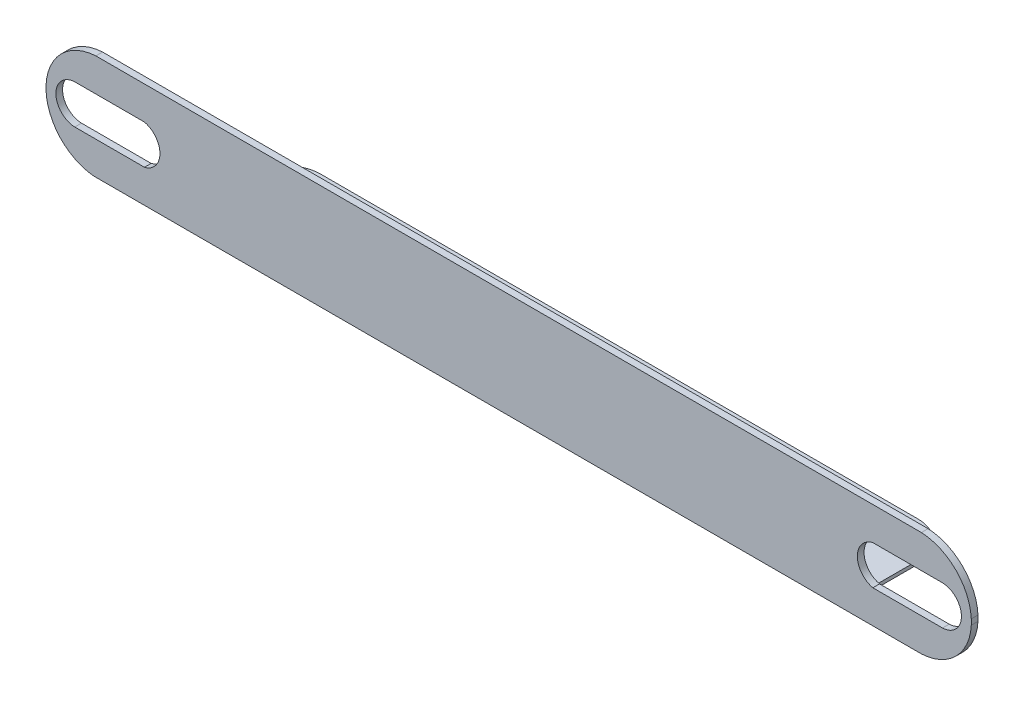
ISO-10303-21;
HEADER;
FILE_DESCRIPTION(('STEP AP214'),'2;1');
FILE_NAME('part.step','',(''),(''),'','','');
FILE_SCHEMA(('AUTOMOTIVE_DESIGN { 1 0 10303 214 1 1 1 1 }'));
ENDSEC;
DATA;
#1=APPLICATION_CONTEXT('core data for automotive mechanical design processes');
#2=APPLICATION_PROTOCOL_DEFINITION('international standard','automotive_design',2000,#1);
#3=PRODUCT_CONTEXT('',#1,'mechanical');
#4=PRODUCT('Part','Part','',(#3));
#5=PRODUCT_RELATED_PRODUCT_CATEGORY('part','',(#4));
#6=PRODUCT_DEFINITION_FORMATION('','',#4);
#7=PRODUCT_DEFINITION_CONTEXT('part definition',#1,'design');
#8=PRODUCT_DEFINITION('design','',#6,#7);
#9=PRODUCT_DEFINITION_SHAPE('','',#8);
#10=(LENGTH_UNIT() NAMED_UNIT(*) SI_UNIT(.MILLI.,.METRE.));
#11=(NAMED_UNIT(*) PLANE_ANGLE_UNIT() SI_UNIT($,.RADIAN.));
#12=(NAMED_UNIT(*) SI_UNIT($,.STERADIAN.) SOLID_ANGLE_UNIT());
#13=UNCERTAINTY_MEASURE_WITH_UNIT(LENGTH_MEASURE(1.E-05),#10,'distance_accuracy_value','');
#14=(GEOMETRIC_REPRESENTATION_CONTEXT(3) GLOBAL_UNCERTAINTY_ASSIGNED_CONTEXT((#13)) GLOBAL_UNIT_ASSIGNED_CONTEXT((#10,
#11,#12)) REPRESENTATION_CONTEXT('',''));
#15=CARTESIAN_POINT('',(0.,0.,0.));
#16=DIRECTION('',(0.,0.,1.));
#17=DIRECTION('',(1.,0.,0.));
#18=AXIS2_PLACEMENT_3D('',#15,#16,#17);
#19=CARTESIAN_POINT('',(0.,0.,0.));
#20=DIRECTION('',(0.,0.,1.));
#21=DIRECTION('',(1.,0.,0.));
#22=AXIS2_PLACEMENT_3D('',#19,#20,#21);
#23=PLANE('',#22);
#24=DIRECTION('',(0.,-1.,0.));
#25=VECTOR('',#24,1.);
#26=CARTESIAN_POINT('',(126.490507007269,-18.669,0.));
#27=LINE('',#26,#25);
#28=CARTESIAN_POINT('',(126.490507007269,-18.669,0.));
#29=VERTEX_POINT('',#28);
#30=CARTESIAN_POINT('',(126.490507007269,-19.939,0.));
#31=VERTEX_POINT('',#30);
#32=EDGE_CURVE('E283',#29,#31,#27,.T.);
#33=ORIENTED_EDGE('',*,*,#32,.F.);
#34=DIRECTION('',(-1.,0.,0.));
#35=VECTOR('',#34,1.);
#36=CARTESIAN_POINT('',(126.490507007269,-18.669,0.));
#37=LINE('',#36,#35);
#38=CARTESIAN_POINT('',(-127.388509507288,-18.669,0.));
#39=VERTEX_POINT('',#38);
#40=EDGE_CURVE('E250',#29,#39,#37,.T.);
#41=ORIENTED_EDGE('',*,*,#40,.T.);
#42=DIRECTION('',(0.,-1.,0.));
#43=VECTOR('',#42,1.);
#44=CARTESIAN_POINT('',(-127.388509507288,-18.669,0.));
#45=LINE('',#44,#43);
#46=CARTESIAN_POINT('',(-127.388509507288,-19.939,0.));
#47=VERTEX_POINT('',#46);
#48=EDGE_CURVE('E269',#39,#47,#45,.T.);
#49=ORIENTED_EDGE('',*,*,#48,.T.);
#50=DIRECTION('',(1.,0.,0.));
#51=VECTOR('',#50,1.);
#52=CARTESIAN_POINT('',(-175.514,-19.939,0.));
#53=LINE('',#52,#51);
#54=CARTESIAN_POINT('',(-157.487509507288,-19.939,0.));
#55=VERTEX_POINT('',#54);
#56=EDGE_CURVE('E347',#55,#47,#53,.T.);
#57=ORIENTED_EDGE('',*,*,#56,.F.);
#58=CARTESIAN_POINT('',(-155.520491397108,-0.0336170515393196,0.));
#59=DIRECTION('',(0.,0.,1.));
#60=DIRECTION('',(1.,0.,0.));
#61=AXIS2_PLACEMENT_3D('',#58,#59,#60);
#62=CIRCLE('',#61,20.0023356278872);
#63=CARTESIAN_POINT('',(-175.514,-0.62779237643969,0.));
#64=VERTEX_POINT('',#63);
#65=EDGE_CURVE('E308',#55,#64,#62,.F.);
#66=ORIENTED_EDGE('',*,*,#65,.T.);
#67=DIRECTION('',(0.,-1.,0.));
#68=VECTOR('',#67,1.);
#69=CARTESIAN_POINT('',(-175.514,19.939,0.));
#70=LINE('',#69,#68);
#71=CARTESIAN_POINT('',(-175.514,0.560558273361051,0.));
#72=VERTEX_POINT('',#71);
#73=EDGE_CURVE('E334',#72,#64,#70,.T.);
#74=ORIENTED_EDGE('',*,*,#73,.F.);
#75=CARTESIAN_POINT('',(-155.520491397108,-0.0336170515393196,0.));
#76=DIRECTION('',(0.,0.,1.));
#77=DIRECTION('',(1.,0.,0.));
#78=AXIS2_PLACEMENT_3D('',#75,#76,#77);
#79=CIRCLE('',#78,20.0023356278872);
#80=CARTESIAN_POINT('',(-156.610444920523,19.939,0.));
#81=VERTEX_POINT('',#80);
#82=EDGE_CURVE('E326',#72,#81,#79,.F.);
#83=ORIENTED_EDGE('',*,*,#82,.T.);
#84=DIRECTION('',(1.,0.,0.));
#85=VECTOR('',#84,1.);
#86=CARTESIAN_POINT('',(-175.514,19.939,0.));
#87=LINE('',#86,#85);
#88=CARTESIAN_POINT('',(156.589507007269,19.939,0.));
#89=VERTEX_POINT('',#88);
#90=EDGE_CURVE('E36',#81,#89,#87,.T.);
#91=ORIENTED_EDGE('',*,*,#90,.T.);
#92=CARTESIAN_POINT('',(155.576786348696,0.,0.));
#93=DIRECTION('',(0.,0.,1.));
#94=DIRECTION('',(1.,0.,0.));
#95=AXIS2_PLACEMENT_3D('',#92,#93,#94);
#96=CIRCLE('',#95,19.9647019545071);
#97=CARTESIAN_POINT('',(175.514,1.04729936244267,0.));
#98=VERTEX_POINT('',#97);
#99=EDGE_CURVE('E321',#98,#89,#96,.T.);
#100=ORIENTED_EDGE('',*,*,#99,.F.);
#101=DIRECTION('',(0.,-1.,0.));
#102=VECTOR('',#101,1.);
#103=CARTESIAN_POINT('',(175.514,19.939,0.));
#104=LINE('',#103,#102);
#105=CARTESIAN_POINT('',(175.514,-1.04729936244268,0.));
#106=VERTEX_POINT('',#105);
#107=EDGE_CURVE('E349',#98,#106,#104,.T.);
#108=ORIENTED_EDGE('',*,*,#107,.T.);
#109=CARTESIAN_POINT('',(155.576786348696,0.,0.));
#110=DIRECTION('',(0.,0.,1.));
#111=DIRECTION('',(1.,0.,0.));
#112=AXIS2_PLACEMENT_3D('',#109,#110,#111);
#113=CIRCLE('',#112,19.9647019545071);
#114=CARTESIAN_POINT('',(156.589507007269,-19.939,0.));
#115=VERTEX_POINT('',#114);
#116=EDGE_CURVE('E299',#115,#106,#113,.T.);
#117=ORIENTED_EDGE('',*,*,#116,.F.);
#118=EDGE_CURVE('E346',#31,#115,#53,.T.);
#119=ORIENTED_EDGE('',*,*,#118,.F.);
#120=EDGE_LOOP('',(#33,#41,#49,#57,#66,#74,#83,#91,#100,#108,#117,#119));
#121=FACE_BOUND('',#120,.T.);
#122=DIRECTION('',(-1.,0.,0.));
#123=VECTOR('',#122,1.);
#124=CARTESIAN_POINT('',(164.606102616265,-7.42142155966785,0.));
#125=LINE('',#124,#123);
#126=CARTESIAN_POINT('',(164.606102616265,-7.42142155966785,0.));
#127=VERTEX_POINT('',#126);
#128=CARTESIAN_POINT('',(138.164214662757,-7.42142155966785,0.));
#129=VERTEX_POINT('',#128);
#130=EDGE_CURVE('E233',#127,#129,#125,.T.);
#131=ORIENTED_EDGE('',*,*,#130,.F.);
#132=CARTESIAN_POINT('',(164.350651350304,-0.00285669356231286,0.));
#133=DIRECTION('',(0.,0.,-1.));
#134=DIRECTION('',(1.,0.,0.));
#135=AXIS2_PLACEMENT_3D('',#132,#133,#134);
#136=CIRCLE('',#135,7.42296167455393);
#137=CARTESIAN_POINT('',(164.606102616265,7.41570817254322,0.));
#138=VERTEX_POINT('',#137);
#139=EDGE_CURVE('E214',#138,#127,#136,.T.);
#140=ORIENTED_EDGE('',*,*,#139,.F.);
#141=DIRECTION('',(1.,0.,0.));
#142=VECTOR('',#141,1.);
#143=CARTESIAN_POINT('',(164.606102616265,7.41570817254322,0.));
#144=LINE('',#143,#142);
#145=CARTESIAN_POINT('',(138.164214662757,7.41570817254322,0.));
#146=VERTEX_POINT('',#145);
#147=EDGE_CURVE('E222',#146,#138,#144,.T.);
#148=ORIENTED_EDGE('',*,*,#147,.F.);
#149=CARTESIAN_POINT('',(139.90470175762,-0.00285669356231297,0.));
#150=DIRECTION('',(0.,0.,-1.));
#151=DIRECTION('',(1.,0.,0.));
#152=AXIS2_PLACEMENT_3D('',#149,#150,#151);
#153=CIRCLE('',#152,7.62);
#154=EDGE_CURVE('E236',#129,#146,#153,.T.);
#155=ORIENTED_EDGE('',*,*,#154,.F.);
#156=EDGE_LOOP('',(#131,#140,#148,#155));
#157=FACE_BOUND('',#156,.T.);
#158=CARTESIAN_POINT('',(-164.350651350304,-0.00285669356231286,0.));
#159=DIRECTION('',(0.,0.,1.));
#160=DIRECTION('',(-1.,0.,0.));
#161=AXIS2_PLACEMENT_3D('',#158,#159,#160);
#162=CIRCLE('',#161,7.42296167455393);
#163=CARTESIAN_POINT('',(-164.606102616265,7.41570817254322,0.));
#164=VERTEX_POINT('',#163);
#165=CARTESIAN_POINT('',(-164.606102616265,-7.42142155966785,0.));
#166=VERTEX_POINT('',#165);
#167=EDGE_CURVE('E49',#164,#166,#162,.T.);
#168=ORIENTED_EDGE('',*,*,#167,.T.);
#169=DIRECTION('',(1.,0.,0.));
#170=VECTOR('',#169,1.);
#171=CARTESIAN_POINT('',(-164.606102616265,-7.42142155966785,0.));
#172=LINE('',#171,#170);
#173=CARTESIAN_POINT('',(-138.164214662757,-7.42142155966785,0.));
#174=VERTEX_POINT('',#173);
#175=EDGE_CURVE('E199',#166,#174,#172,.T.);
#176=ORIENTED_EDGE('',*,*,#175,.T.);
#177=CARTESIAN_POINT('',(-139.90470175762,-0.00285669356231297,0.));
#178=DIRECTION('',(0.,0.,1.));
#179=DIRECTION('',(-1.,0.,0.));
#180=AXIS2_PLACEMENT_3D('',#177,#178,#179);
#181=CIRCLE('',#180,7.62);
#182=CARTESIAN_POINT('',(-138.164214662757,7.41570817254322,0.));
#183=VERTEX_POINT('',#182);
#184=EDGE_CURVE('E202',#174,#183,#181,.T.);
#185=ORIENTED_EDGE('',*,*,#184,.T.);
#186=DIRECTION('',(-1.,0.,0.));
#187=VECTOR('',#186,1.);
#188=CARTESIAN_POINT('',(-164.606102616265,7.41570817254322,0.));
#189=LINE('',#188,#187);
#190=EDGE_CURVE('E208',#183,#164,#189,.T.);
#191=ORIENTED_EDGE('',*,*,#190,.T.);
#192=EDGE_LOOP('',(#168,#176,#185,#191));
#193=FACE_BOUND('',#192,.T.);
#194=ADVANCED_FACE('F32',(#121,#157,#193),#23,.F.);
#195=CARTESIAN_POINT('',(0.,0.,2.54));
#196=DIRECTION('',(0.,0.,1.));
#197=DIRECTION('',(1.,0.,0.));
#198=AXIS2_PLACEMENT_3D('',#195,#196,#197);
#199=PLANE('',#198);
#200=CARTESIAN_POINT('',(164.350651350304,-0.00285669356231286,2.54));
#201=DIRECTION('',(0.,0.,-1.));
#202=DIRECTION('',(1.,0.,0.));
#203=AXIS2_PLACEMENT_3D('',#200,#201,#202);
#204=CIRCLE('',#203,7.42296167455393);
#205=CARTESIAN_POINT('',(164.606102616265,7.41570817254322,2.54));
#206=VERTEX_POINT('',#205);
#207=CARTESIAN_POINT('',(164.606102616265,-7.42142155966785,2.54));
#208=VERTEX_POINT('',#207);
#209=EDGE_CURVE('E218',#206,#208,#204,.T.);
#210=ORIENTED_EDGE('',*,*,#209,.T.);
#211=DIRECTION('',(-1.,0.,0.));
#212=VECTOR('',#211,1.);
#213=CARTESIAN_POINT('',(164.606102616265,-7.42142155966785,2.54));
#214=LINE('',#213,#212);
#215=CARTESIAN_POINT('',(138.164214662757,-7.42142155966785,2.54));
#216=VERTEX_POINT('',#215);
#217=EDGE_CURVE('E221',#208,#216,#214,.T.);
#218=ORIENTED_EDGE('',*,*,#217,.T.);
#219=CARTESIAN_POINT('',(139.90470175762,-0.00285669356231297,2.54));
#220=DIRECTION('',(0.,0.,-1.));
#221=DIRECTION('',(1.,0.,0.));
#222=AXIS2_PLACEMENT_3D('',#219,#220,#221);
#223=CIRCLE('',#222,7.62);
#224=CARTESIAN_POINT('',(138.164214662757,7.41570817254322,2.54));
#225=VERTEX_POINT('',#224);
#226=EDGE_CURVE('E225',#216,#225,#223,.T.);
#227=ORIENTED_EDGE('',*,*,#226,.T.);
#228=DIRECTION('',(1.,0.,0.));
#229=VECTOR('',#228,1.);
#230=CARTESIAN_POINT('',(164.606102616265,7.41570817254322,2.54));
#231=LINE('',#230,#229);
#232=EDGE_CURVE('E228',#225,#206,#231,.T.);
#233=ORIENTED_EDGE('',*,*,#232,.T.);
#234=EDGE_LOOP('',(#210,#218,#227,#233));
#235=FACE_BOUND('',#234,.T.);
#236=CARTESIAN_POINT('',(-155.520491397108,-0.0336170515393196,2.54));
#237=DIRECTION('',(0.,0.,1.));
#238=DIRECTION('',(1.,0.,0.));
#239=AXIS2_PLACEMENT_3D('',#236,#237,#238);
#240=CIRCLE('',#239,20.0023356278872);
#241=CARTESIAN_POINT('',(-157.487509507288,-19.939,2.54));
#242=VERTEX_POINT('',#241);
#243=CARTESIAN_POINT('',(-175.514,-0.62779237643969,2.54));
#244=VERTEX_POINT('',#243);
#245=EDGE_CURVE('E313',#242,#244,#240,.F.);
#246=ORIENTED_EDGE('',*,*,#245,.F.);
#247=DIRECTION('',(1.,0.,0.));
#248=VECTOR('',#247,1.);
#249=CARTESIAN_POINT('',(-175.514,-19.939,2.54));
#250=LINE('',#249,#248);
#251=CARTESIAN_POINT('',(156.589507007269,-19.939,2.54));
#252=VERTEX_POINT('',#251);
#253=EDGE_CURVE('E339',#242,#252,#250,.T.);
#254=ORIENTED_EDGE('',*,*,#253,.T.);
#255=CARTESIAN_POINT('',(155.576786348696,0.,2.54));
#256=DIRECTION('',(0.,0.,1.));
#257=DIRECTION('',(1.,0.,0.));
#258=AXIS2_PLACEMENT_3D('',#255,#256,#257);
#259=CIRCLE('',#258,19.9647019545071);
#260=CARTESIAN_POINT('',(175.514,-1.04729936244268,2.54));
#261=VERTEX_POINT('',#260);
#262=EDGE_CURVE('E301',#252,#261,#259,.T.);
#263=ORIENTED_EDGE('',*,*,#262,.T.);
#264=DIRECTION('',(0.,-1.,0.));
#265=VECTOR('',#264,1.);
#266=CARTESIAN_POINT('',(175.514,19.939,2.54));
#267=LINE('',#266,#265);
#268=CARTESIAN_POINT('',(175.514,1.04729936244268,2.54));
#269=VERTEX_POINT('',#268);
#270=EDGE_CURVE('E41',#269,#261,#267,.T.);
#271=ORIENTED_EDGE('',*,*,#270,.F.);
#272=CARTESIAN_POINT('',(155.576786348696,0.,2.54));
#273=DIRECTION('',(0.,0.,1.));
#274=DIRECTION('',(1.,0.,0.));
#275=AXIS2_PLACEMENT_3D('',#272,#273,#274);
#276=CIRCLE('',#275,19.9647019545071);
#277=CARTESIAN_POINT('',(156.589507007269,19.939,2.54));
#278=VERTEX_POINT('',#277);
#279=EDGE_CURVE('E312',#269,#278,#276,.T.);
#280=ORIENTED_EDGE('',*,*,#279,.T.);
#281=DIRECTION('',(1.,0.,0.));
#282=VECTOR('',#281,1.);
#283=CARTESIAN_POINT('',(-175.514,19.939,2.54));
#284=LINE('',#283,#282);
#285=CARTESIAN_POINT('',(-156.610444920523,19.939,2.54));
#286=VERTEX_POINT('',#285);
#287=EDGE_CURVE('E11',#286,#278,#284,.T.);
#288=ORIENTED_EDGE('',*,*,#287,.F.);
#289=CARTESIAN_POINT('',(-155.520491397108,-0.0336170515393196,2.54));
#290=DIRECTION('',(0.,0.,1.));
#291=DIRECTION('',(1.,0.,0.));
#292=AXIS2_PLACEMENT_3D('',#289,#290,#291);
#293=CIRCLE('',#292,20.0023356278872);
#294=CARTESIAN_POINT('',(-175.514,0.560558273361051,2.54));
#295=VERTEX_POINT('',#294);
#296=EDGE_CURVE('E315',#295,#286,#293,.F.);
#297=ORIENTED_EDGE('',*,*,#296,.F.);
#298=DIRECTION('',(0.,-1.,0.));
#299=VECTOR('',#298,1.);
#300=CARTESIAN_POINT('',(-175.514,19.939,2.54));
#301=LINE('',#300,#299);
#302=EDGE_CURVE('E336',#295,#244,#301,.T.);
#303=ORIENTED_EDGE('',*,*,#302,.T.);
#304=EDGE_LOOP('',(#246,#254,#263,#271,#280,#288,#297,#303));
#305=FACE_BOUND('',#304,.T.);
#306=DIRECTION('',(1.,0.,0.));
#307=VECTOR('',#306,1.);
#308=CARTESIAN_POINT('',(-164.606102616265,-7.42142155966785,2.54));
#309=LINE('',#308,#307);
#310=CARTESIAN_POINT('',(-164.606102616265,-7.42142155966785,2.54));
#311=VERTEX_POINT('',#310);
#312=CARTESIAN_POINT('',(-138.164214662757,-7.42142155966785,2.54));
#313=VERTEX_POINT('',#312);
#314=EDGE_CURVE('E195',#311,#313,#309,.T.);
#315=ORIENTED_EDGE('',*,*,#314,.F.);
#316=CARTESIAN_POINT('',(-164.350651350304,-0.00285669356231286,2.54));
#317=DIRECTION('',(0.,0.,1.));
#318=DIRECTION('',(-1.,0.,0.));
#319=AXIS2_PLACEMENT_3D('',#316,#317,#318);
#320=CIRCLE('',#319,7.42296167455393);
#321=CARTESIAN_POINT('',(-164.606102616265,7.41570817254322,2.54));
#322=VERTEX_POINT('',#321);
#323=EDGE_CURVE('E191',#322,#311,#320,.T.);
#324=ORIENTED_EDGE('',*,*,#323,.F.);
#325=DIRECTION('',(-1.,0.,0.));
#326=VECTOR('',#325,1.);
#327=CARTESIAN_POINT('',(-164.606102616265,7.41570817254322,2.54));
#328=LINE('',#327,#326);
#329=CARTESIAN_POINT('',(-138.164214662757,7.41570817254322,2.54));
#330=VERTEX_POINT('',#329);
#331=EDGE_CURVE('E183',#330,#322,#328,.T.);
#332=ORIENTED_EDGE('',*,*,#331,.F.);
#333=CARTESIAN_POINT('',(-139.90470175762,-0.00285669356231297,2.54));
#334=DIRECTION('',(0.,0.,1.));
#335=DIRECTION('',(-1.,0.,0.));
#336=AXIS2_PLACEMENT_3D('',#333,#334,#335);
#337=CIRCLE('',#336,7.62);
#338=EDGE_CURVE('E190',#313,#330,#337,.T.);
#339=ORIENTED_EDGE('',*,*,#338,.F.);
#340=EDGE_LOOP('',(#315,#324,#332,#339));
#341=FACE_BOUND('',#340,.T.);
#342=ADVANCED_FACE('F198',(#235,#305,#341),#199,.T.);
#343=CARTESIAN_POINT('',(-175.514,-19.939,2.54));
#344=DIRECTION('',(0.,1.,0.));
#345=DIRECTION('',(0.,0.,1.));
#346=AXIS2_PLACEMENT_3D('',#343,#344,#345);
#347=PLANE('',#346);
#348=ORIENTED_EDGE('',*,*,#253,.F.);
#349=DIRECTION('',(0.,0.,1.));
#350=VECTOR('',#349,1.);
#351=CARTESIAN_POINT('',(-157.487509507288,-19.939,0.));
#352=LINE('',#351,#350);
#353=EDGE_CURVE('E306',#55,#242,#352,.T.);
#354=ORIENTED_EDGE('',*,*,#353,.F.);
#355=ORIENTED_EDGE('',*,*,#56,.T.);
#356=DIRECTION('',(0.,0.,-1.));
#357=VECTOR('',#356,1.);
#358=CARTESIAN_POINT('',(-127.388509507288,-19.939,0.));
#359=LINE('',#358,#357);
#360=CARTESIAN_POINT('',(-127.388509507288,-19.939,-26.2316343151917));
#361=VERTEX_POINT('',#360);
#362=EDGE_CURVE('E243',#47,#361,#359,.T.);
#363=ORIENTED_EDGE('',*,*,#362,.T.);
#364=CARTESIAN_POINT('',(-113.739754397186,-19.939,-26.2292527050703));
#365=DIRECTION('',(0.,-1.,0.));
#366=DIRECTION('',(0.,0.,-1.));
#367=AXIS2_PLACEMENT_3D('',#364,#365,#366);
#368=CIRCLE('',#367,13.6487553178885);
#369=CARTESIAN_POINT('',(-113.754553273446,-19.939,-39.878));
#370=VERTEX_POINT('',#369);
#371=EDGE_CURVE('E272',#361,#370,#368,.T.);
#372=ORIENTED_EDGE('',*,*,#371,.T.);
#373=DIRECTION('',(1.,0.,0.));
#374=VECTOR('',#373,1.);
#375=CARTESIAN_POINT('',(-113.754553273446,-19.939,-39.878));
#376=LINE('',#375,#374);
#377=CARTESIAN_POINT('',(112.61593456072,-19.939,-39.878));
#378=VERTEX_POINT('',#377);
#379=EDGE_CURVE('E275',#370,#378,#376,.T.);
#380=ORIENTED_EDGE('',*,*,#379,.T.);
#381=CARTESIAN_POINT('',(112.871327050972,-19.939,-26.2316343151917));
#382=DIRECTION('',(0.,-1.,0.));
#383=DIRECTION('',(0.,0.,-1.));
#384=AXIS2_PLACEMENT_3D('',#381,#382,#383);
#385=CIRCLE('',#384,13.6487553178885);
#386=CARTESIAN_POINT('',(126.490507007269,-19.939,-27.12966496365));
#387=VERTEX_POINT('',#386);
#388=EDGE_CURVE('E278',#378,#387,#385,.T.);
#389=ORIENTED_EDGE('',*,*,#388,.T.);
#390=DIRECTION('',(0.,0.,1.));
#391=VECTOR('',#390,1.);
#392=CARTESIAN_POINT('',(126.490507007269,-19.939,-27.12966496365));
#393=LINE('',#392,#391);
#394=EDGE_CURVE('E254',#387,#31,#393,.T.);
#395=ORIENTED_EDGE('',*,*,#394,.T.);
#396=ORIENTED_EDGE('',*,*,#118,.T.);
#397=DIRECTION('',(0.,0.,1.));
#398=VECTOR('',#397,1.);
#399=CARTESIAN_POINT('',(156.589507007269,-19.939,0.));
#400=LINE('',#399,#398);
#401=EDGE_CURVE('E296',#115,#252,#400,.T.);
#402=ORIENTED_EDGE('',*,*,#401,.T.);
#403=EDGE_LOOP('',(#348,#354,#355,#363,#372,#380,#389,#395,#396,#402));
#404=FACE_BOUND('',#403,.T.);
#405=ADVANCED_FACE('F379',(#404),#347,.F.);
#406=CARTESIAN_POINT('',(175.514,19.939,2.54));
#407=DIRECTION('',(1.,0.,0.));
#408=DIRECTION('',(0.,0.,-1.));
#409=AXIS2_PLACEMENT_3D('',#406,#407,#408);
#410=PLANE('',#409);
#411=ORIENTED_EDGE('',*,*,#107,.F.);
#412=DIRECTION('',(0.,0.,1.));
#413=VECTOR('',#412,1.);
#414=CARTESIAN_POINT('',(175.514,1.04729936244268,0.));
#415=LINE('',#414,#413);
#416=EDGE_CURVE('E318',#98,#269,#415,.T.);
#417=ORIENTED_EDGE('',*,*,#416,.T.);
#418=ORIENTED_EDGE('',*,*,#270,.T.);
#419=DIRECTION('',(0.,0.,1.));
#420=VECTOR('',#419,1.);
#421=CARTESIAN_POINT('',(175.514,-1.04729936244268,0.));
#422=LINE('',#421,#420);
#423=EDGE_CURVE('E285',#106,#261,#422,.T.);
#424=ORIENTED_EDGE('',*,*,#423,.F.);
#425=EDGE_LOOP('',(#411,#417,#418,#424));
#426=FACE_BOUND('',#425,.T.);
#427=ADVANCED_FACE('F372',(#426),#410,.T.);
#428=CARTESIAN_POINT('',(-175.514,19.939,2.54));
#429=DIRECTION('',(0.,1.,0.));
#430=DIRECTION('',(0.,0.,1.));
#431=AXIS2_PLACEMENT_3D('',#428,#429,#430);
#432=PLANE('',#431);
#433=ORIENTED_EDGE('',*,*,#287,.T.);
#434=DIRECTION('',(0.,0.,1.));
#435=VECTOR('',#434,1.);
#436=CARTESIAN_POINT('',(156.589507007269,19.939,0.));
#437=LINE('',#436,#435);
#438=EDGE_CURVE('E304',#89,#278,#437,.T.);
#439=ORIENTED_EDGE('',*,*,#438,.F.);
#440=ORIENTED_EDGE('',*,*,#90,.F.);
#441=DIRECTION('',(0.,0.,1.));
#442=VECTOR('',#441,1.);
#443=CARTESIAN_POINT('',(-156.610444920523,19.939,0.));
#444=LINE('',#443,#442);
#445=EDGE_CURVE('E331',#81,#286,#444,.T.);
#446=ORIENTED_EDGE('',*,*,#445,.T.);
#447=EDGE_LOOP('',(#433,#439,#440,#446));
#448=FACE_BOUND('',#447,.T.);
#449=ADVANCED_FACE('F362',(#448),#432,.T.);
#450=CARTESIAN_POINT('',(-175.514,19.939,2.54));
#451=DIRECTION('',(1.,0.,0.));
#452=DIRECTION('',(0.,0.,-1.));
#453=AXIS2_PLACEMENT_3D('',#450,#451,#452);
#454=PLANE('',#453);
#455=ORIENTED_EDGE('',*,*,#73,.T.);
#456=DIRECTION('',(0.,0.,1.));
#457=VECTOR('',#456,1.);
#458=CARTESIAN_POINT('',(-175.514,-0.62779237643969,0.));
#459=LINE('',#458,#457);
#460=EDGE_CURVE('E309',#64,#244,#459,.T.);
#461=ORIENTED_EDGE('',*,*,#460,.T.);
#462=ORIENTED_EDGE('',*,*,#302,.F.);
#463=DIRECTION('',(0.,0.,1.));
#464=VECTOR('',#463,1.);
#465=CARTESIAN_POINT('',(-175.514,0.560558273361051,0.));
#466=LINE('',#465,#464);
#467=EDGE_CURVE('E329',#72,#295,#466,.T.);
#468=ORIENTED_EDGE('',*,*,#467,.F.);
#469=EDGE_LOOP('',(#455,#461,#462,#468));
#470=FACE_BOUND('',#469,.T.);
#471=ADVANCED_FACE('F34',(#470),#454,.F.);
#472=CARTESIAN_POINT('',(-155.520491397108,-0.0336170515393196,0.));
#473=DIRECTION('',(0.,0.,1.));
#474=DIRECTION('',(1.,0.,0.));
#475=AXIS2_PLACEMENT_3D('',#472,#473,#474);
#476=CYLINDRICAL_SURFACE('',#475,20.0023356278872);
#477=ORIENTED_EDGE('',*,*,#296,.T.);
#478=ORIENTED_EDGE('',*,*,#445,.F.);
#479=ORIENTED_EDGE('',*,*,#82,.F.);
#480=ORIENTED_EDGE('',*,*,#467,.T.);
#481=EDGE_LOOP('',(#477,#478,#479,#480));
#482=FACE_BOUND('',#481,.T.);
#483=ADVANCED_FACE('F400',(#482),#476,.T.);
#484=CARTESIAN_POINT('',(155.576786348696,0.,0.));
#485=DIRECTION('',(0.,0.,1.));
#486=DIRECTION('',(1.,0.,0.));
#487=AXIS2_PLACEMENT_3D('',#484,#485,#486);
#488=CYLINDRICAL_SURFACE('',#487,19.9647019545071);
#489=ORIENTED_EDGE('',*,*,#262,.F.);
#490=ORIENTED_EDGE('',*,*,#401,.F.);
#491=ORIENTED_EDGE('',*,*,#116,.T.);
#492=ORIENTED_EDGE('',*,*,#423,.T.);
#493=EDGE_LOOP('',(#489,#490,#491,#492));
#494=FACE_BOUND('',#493,.T.);
#495=ADVANCED_FACE('F374',(#494),#488,.T.);
#496=CARTESIAN_POINT('',(155.576786348696,0.,0.));
#497=DIRECTION('',(0.,0.,1.));
#498=DIRECTION('',(1.,0.,0.));
#499=AXIS2_PLACEMENT_3D('',#496,#497,#498);
#500=CYLINDRICAL_SURFACE('',#499,19.9647019545071);
#501=ORIENTED_EDGE('',*,*,#279,.F.);
#502=ORIENTED_EDGE('',*,*,#416,.F.);
#503=ORIENTED_EDGE('',*,*,#99,.T.);
#504=ORIENTED_EDGE('',*,*,#438,.T.);
#505=EDGE_LOOP('',(#501,#502,#503,#504));
#506=FACE_BOUND('',#505,.T.);
#507=ADVANCED_FACE('F365',(#506),#500,.T.);
#508=CARTESIAN_POINT('',(-155.520491397108,-0.0336170515393196,0.));
#509=DIRECTION('',(0.,0.,1.));
#510=DIRECTION('',(1.,0.,0.));
#511=AXIS2_PLACEMENT_3D('',#508,#509,#510);
#512=CYLINDRICAL_SURFACE('',#511,20.0023356278872);
#513=ORIENTED_EDGE('',*,*,#245,.T.);
#514=ORIENTED_EDGE('',*,*,#460,.F.);
#515=ORIENTED_EDGE('',*,*,#65,.F.);
#516=ORIENTED_EDGE('',*,*,#353,.T.);
#517=EDGE_LOOP('',(#513,#514,#515,#516));
#518=FACE_BOUND('',#517,.T.);
#519=ADVANCED_FACE('F395',(#518),#512,.T.);
#520=CARTESIAN_POINT('',(126.490507007269,-18.669,-27.12966496365));
#521=DIRECTION('',(1.,0.,0.));
#522=DIRECTION('',(0.,0.,-1.));
#523=AXIS2_PLACEMENT_3D('',#520,#521,#522);
#524=PLANE('',#523);
#525=ORIENTED_EDGE('',*,*,#394,.F.);
#526=DIRECTION('',(0.,-1.,0.));
#527=VECTOR('',#526,1.);
#528=CARTESIAN_POINT('',(126.490507007269,-18.669,-27.12966496365));
#529=LINE('',#528,#527);
#530=CARTESIAN_POINT('',(126.490507007269,-18.669,-27.12966496365));
#531=VERTEX_POINT('',#530);
#532=EDGE_CURVE('E286',#531,#387,#529,.T.);
#533=ORIENTED_EDGE('',*,*,#532,.F.);
#534=DIRECTION('',(0.,0.,1.));
#535=VECTOR('',#534,1.);
#536=CARTESIAN_POINT('',(126.490507007269,-18.669,-27.12966496365));
#537=LINE('',#536,#535);
#538=EDGE_CURVE('E266',#531,#29,#537,.T.);
#539=ORIENTED_EDGE('',*,*,#538,.T.);
#540=ORIENTED_EDGE('',*,*,#32,.T.);
#541=EDGE_LOOP('',(#525,#533,#539,#540));
#542=FACE_BOUND('',#541,.T.);
#543=ADVANCED_FACE('F383',(#542),#524,.T.);
#544=CARTESIAN_POINT('',(112.871327050972,-18.669,-26.2316343151917));
#545=DIRECTION('',(0.,-1.,0.));
#546=DIRECTION('',(0.,0.,-1.));
#547=AXIS2_PLACEMENT_3D('',#544,#545,#546);
#548=CYLINDRICAL_SURFACE('',#547,13.6487553178885);
#549=ORIENTED_EDGE('',*,*,#388,.F.);
#550=DIRECTION('',(0.,-1.,0.));
#551=VECTOR('',#550,1.);
#552=CARTESIAN_POINT('',(112.61593456072,-18.669,-39.878));
#553=LINE('',#552,#551);
#554=CARTESIAN_POINT('',(112.61593456072,-18.669,-39.878));
#555=VERTEX_POINT('',#554);
#556=EDGE_CURVE('E288',#555,#378,#553,.T.);
#557=ORIENTED_EDGE('',*,*,#556,.F.);
#558=CARTESIAN_POINT('',(112.871327050972,-18.669,-26.2316343151917));
#559=DIRECTION('',(0.,-1.,0.));
#560=DIRECTION('',(0.,0.,-1.));
#561=AXIS2_PLACEMENT_3D('',#558,#559,#560);
#562=CIRCLE('',#561,13.6487553178885);
#563=EDGE_CURVE('E263',#555,#531,#562,.T.);
#564=ORIENTED_EDGE('',*,*,#563,.T.);
#565=ORIENTED_EDGE('',*,*,#532,.T.);
#566=EDGE_LOOP('',(#549,#557,#564,#565));
#567=FACE_BOUND('',#566,.T.);
#568=ADVANCED_FACE('F471',(#567),#548,.T.);
#569=CARTESIAN_POINT('',(-113.754553273446,-18.669,-39.878));
#570=DIRECTION('',(0.,0.,-1.));
#571=DIRECTION('',(-1.,0.,0.));
#572=AXIS2_PLACEMENT_3D('',#569,#570,#571);
#573=PLANE('',#572);
#574=ORIENTED_EDGE('',*,*,#379,.F.);
#575=DIRECTION('',(0.,-1.,0.));
#576=VECTOR('',#575,1.);
#577=CARTESIAN_POINT('',(-113.754553273446,-18.669,-39.878));
#578=LINE('',#577,#576);
#579=CARTESIAN_POINT('',(-113.754553273446,-18.669,-39.878));
#580=VERTEX_POINT('',#579);
#581=EDGE_CURVE('E290',#580,#370,#578,.T.);
#582=ORIENTED_EDGE('',*,*,#581,.F.);
#583=DIRECTION('',(1.,0.,0.));
#584=VECTOR('',#583,1.);
#585=CARTESIAN_POINT('',(-113.754553273446,-18.669,-39.878));
#586=LINE('',#585,#584);
#587=EDGE_CURVE('E260',#580,#555,#586,.T.);
#588=ORIENTED_EDGE('',*,*,#587,.T.);
#589=ORIENTED_EDGE('',*,*,#556,.T.);
#590=EDGE_LOOP('',(#574,#582,#588,#589));
#591=FACE_BOUND('',#590,.T.);
#592=ADVANCED_FACE('F478',(#591),#573,.T.);
#593=CARTESIAN_POINT('',(-113.739754397186,-18.669,-26.2292527050703));
#594=DIRECTION('',(0.,-1.,0.));
#595=DIRECTION('',(0.,0.,-1.));
#596=AXIS2_PLACEMENT_3D('',#593,#594,#595);
#597=CYLINDRICAL_SURFACE('',#596,13.6487553178885);
#598=ORIENTED_EDGE('',*,*,#371,.F.);
#599=DIRECTION('',(0.,-1.,0.));
#600=VECTOR('',#599,1.);
#601=CARTESIAN_POINT('',(-127.388509507288,-18.669,-26.2316343151917));
#602=LINE('',#601,#600);
#603=CARTESIAN_POINT('',(-127.388509507288,-18.669,-26.2316343151917));
#604=VERTEX_POINT('',#603);
#605=EDGE_CURVE('E292',#604,#361,#602,.T.);
#606=ORIENTED_EDGE('',*,*,#605,.F.);
#607=CARTESIAN_POINT('',(-113.739754397186,-18.669,-26.2292527050703));
#608=DIRECTION('',(0.,-1.,0.));
#609=DIRECTION('',(0.,0.,-1.));
#610=AXIS2_PLACEMENT_3D('',#607,#608,#609);
#611=CIRCLE('',#610,13.6487553178885);
#612=EDGE_CURVE('E257',#604,#580,#611,.T.);
#613=ORIENTED_EDGE('',*,*,#612,.T.);
#614=ORIENTED_EDGE('',*,*,#581,.T.);
#615=EDGE_LOOP('',(#598,#606,#613,#614));
#616=FACE_BOUND('',#615,.T.);
#617=ADVANCED_FACE('F486',(#616),#597,.T.);
#618=CARTESIAN_POINT('',(-127.388509507288,-18.669,0.));
#619=DIRECTION('',(-1.,0.,0.));
#620=DIRECTION('',(0.,0.,1.));
#621=AXIS2_PLACEMENT_3D('',#618,#619,#620);
#622=PLANE('',#621);
#623=ORIENTED_EDGE('',*,*,#362,.F.);
#624=ORIENTED_EDGE('',*,*,#48,.F.);
#625=DIRECTION('',(0.,0.,-1.));
#626=VECTOR('',#625,1.);
#627=CARTESIAN_POINT('',(-127.388509507288,-18.669,0.));
#628=LINE('',#627,#626);
#629=EDGE_CURVE('E253',#39,#604,#628,.T.);
#630=ORIENTED_EDGE('',*,*,#629,.T.);
#631=ORIENTED_EDGE('',*,*,#605,.T.);
#632=EDGE_LOOP('',(#623,#624,#630,#631));
#633=FACE_BOUND('',#632,.T.);
#634=ADVANCED_FACE('F494',(#633),#622,.T.);
#635=CARTESIAN_POINT('',(-113.739754397186,-18.669,-26.2292527050703));
#636=DIRECTION('',(0.,-1.,0.));
#637=DIRECTION('',(0.,0.,-1.));
#638=AXIS2_PLACEMENT_3D('',#635,#636,#637);
#639=PLANE('',#638);
#640=ORIENTED_EDGE('',*,*,#40,.F.);
#641=ORIENTED_EDGE('',*,*,#538,.F.);
#642=ORIENTED_EDGE('',*,*,#563,.F.);
#643=ORIENTED_EDGE('',*,*,#587,.F.);
#644=ORIENTED_EDGE('',*,*,#612,.F.);
#645=ORIENTED_EDGE('',*,*,#629,.F.);
#646=EDGE_LOOP('',(#640,#641,#642,#643,#644,#645));
#647=FACE_BOUND('',#646,.T.);
#648=ADVANCED_FACE('F387',(#647),#639,.F.);
#649=CARTESIAN_POINT('',(164.350651350304,-0.00285669356231286,2.54));
#650=DIRECTION('',(0.,0.,-1.));
#651=DIRECTION('',(-1.,0.,0.));
#652=AXIS2_PLACEMENT_3D('',#649,#650,#651);
#653=CYLINDRICAL_SURFACE('',#652,7.42296167455393);
#654=ORIENTED_EDGE('',*,*,#139,.T.);
#655=DIRECTION('',(0.,0.,-1.));
#656=VECTOR('',#655,1.);
#657=CARTESIAN_POINT('',(164.606102616265,-7.42142155966785,2.54));
#658=LINE('',#657,#656);
#659=EDGE_CURVE('E231',#208,#127,#658,.T.);
#660=ORIENTED_EDGE('',*,*,#659,.F.);
#661=ORIENTED_EDGE('',*,*,#209,.F.);
#662=DIRECTION('',(0.,0.,-1.));
#663=VECTOR('',#662,1.);
#664=CARTESIAN_POINT('',(164.606102616265,7.41570817254322,2.54));
#665=LINE('',#664,#663);
#666=EDGE_CURVE('E241',#206,#138,#665,.T.);
#667=ORIENTED_EDGE('',*,*,#666,.T.);
#668=EDGE_LOOP('',(#654,#660,#661,#667));
#669=FACE_BOUND('',#668,.T.);
#670=ADVANCED_FACE('F508',(#669),#653,.F.);
#671=CARTESIAN_POINT('',(164.606102616265,7.41570817254322,2.54));
#672=DIRECTION('',(0.,1.,0.));
#673=DIRECTION('',(0.,0.,1.));
#674=AXIS2_PLACEMENT_3D('',#671,#672,#673);
#675=PLANE('',#674);
#676=ORIENTED_EDGE('',*,*,#147,.T.);
#677=ORIENTED_EDGE('',*,*,#666,.F.);
#678=ORIENTED_EDGE('',*,*,#232,.F.);
#679=DIRECTION('',(0.,0.,-1.));
#680=VECTOR('',#679,1.);
#681=CARTESIAN_POINT('',(138.164214662757,7.41570817254322,2.54));
#682=LINE('',#681,#680);
#683=EDGE_CURVE('E244',#225,#146,#682,.T.);
#684=ORIENTED_EDGE('',*,*,#683,.T.);
#685=EDGE_LOOP('',(#676,#677,#678,#684));
#686=FACE_BOUND('',#685,.T.);
#687=ADVANCED_FACE('F515',(#686),#675,.F.);
#688=CARTESIAN_POINT('',(139.90470175762,-0.00285669356231297,2.54));
#689=DIRECTION('',(0.,0.,-1.));
#690=DIRECTION('',(-1.,0.,0.));
#691=AXIS2_PLACEMENT_3D('',#688,#689,#690);
#692=CYLINDRICAL_SURFACE('',#691,7.62);
#693=ORIENTED_EDGE('',*,*,#154,.T.);
#694=ORIENTED_EDGE('',*,*,#683,.F.);
#695=ORIENTED_EDGE('',*,*,#226,.F.);
#696=DIRECTION('',(0.,0.,-1.));
#697=VECTOR('',#696,1.);
#698=CARTESIAN_POINT('',(138.164214662757,-7.42142155966785,2.54));
#699=LINE('',#698,#697);
#700=EDGE_CURVE('E246',#216,#129,#699,.T.);
#701=ORIENTED_EDGE('',*,*,#700,.T.);
#702=EDGE_LOOP('',(#693,#694,#695,#701));
#703=FACE_BOUND('',#702,.T.);
#704=ADVANCED_FACE('F523',(#703),#692,.F.);
#705=CARTESIAN_POINT('',(164.606102616265,-7.42142155966785,2.54));
#706=DIRECTION('',(0.,-1.,0.));
#707=DIRECTION('',(0.,0.,-1.));
#708=AXIS2_PLACEMENT_3D('',#705,#706,#707);
#709=PLANE('',#708);
#710=ORIENTED_EDGE('',*,*,#130,.T.);
#711=ORIENTED_EDGE('',*,*,#700,.F.);
#712=ORIENTED_EDGE('',*,*,#217,.F.);
#713=ORIENTED_EDGE('',*,*,#659,.T.);
#714=EDGE_LOOP('',(#710,#711,#712,#713));
#715=FACE_BOUND('',#714,.T.);
#716=ADVANCED_FACE('F531',(#715),#709,.F.);
#717=CARTESIAN_POINT('',(-164.350651350304,-0.00285669356231286,2.54));
#718=DIRECTION('',(0.,0.,-1.));
#719=DIRECTION('',(-1.,0.,0.));
#720=AXIS2_PLACEMENT_3D('',#717,#718,#719);
#721=CYLINDRICAL_SURFACE('',#720,7.42296167455393);
#722=ORIENTED_EDGE('',*,*,#167,.F.);
#723=DIRECTION('',(0.,0.,-1.));
#724=VECTOR('',#723,1.);
#725=CARTESIAN_POINT('',(-164.606102616265,7.41570817254322,2.54));
#726=LINE('',#725,#724);
#727=EDGE_CURVE('E185',#322,#164,#726,.T.);
#728=ORIENTED_EDGE('',*,*,#727,.F.);
#729=ORIENTED_EDGE('',*,*,#323,.T.);
#730=DIRECTION('',(0.,0.,-1.));
#731=VECTOR('',#730,1.);
#732=CARTESIAN_POINT('',(-164.606102616265,-7.42142155966785,2.54));
#733=LINE('',#732,#731);
#734=EDGE_CURVE('E212',#311,#166,#733,.T.);
#735=ORIENTED_EDGE('',*,*,#734,.T.);
#736=EDGE_LOOP('',(#722,#728,#729,#735));
#737=FACE_BOUND('',#736,.T.);
#738=ADVANCED_FACE('F193',(#737),#721,.F.);
#739=CARTESIAN_POINT('',(-164.606102616265,-7.42142155966785,2.54));
#740=DIRECTION('',(0.,1.,0.));
#741=DIRECTION('',(0.,0.,1.));
#742=AXIS2_PLACEMENT_3D('',#739,#740,#741);
#743=PLANE('',#742);
#744=ORIENTED_EDGE('',*,*,#175,.F.);
#745=ORIENTED_EDGE('',*,*,#734,.F.);
#746=ORIENTED_EDGE('',*,*,#314,.T.);
#747=DIRECTION('',(0.,0.,-1.));
#748=VECTOR('',#747,1.);
#749=CARTESIAN_POINT('',(-138.164214662757,-7.42142155966785,2.54));
#750=LINE('',#749,#748);
#751=EDGE_CURVE('E215',#313,#174,#750,.T.);
#752=ORIENTED_EDGE('',*,*,#751,.T.);
#753=EDGE_LOOP('',(#744,#745,#746,#752));
#754=FACE_BOUND('',#753,.T.);
#755=ADVANCED_FACE('F546',(#754),#743,.T.);
#756=CARTESIAN_POINT('',(-139.90470175762,-0.00285669356231297,2.54));
#757=DIRECTION('',(0.,0.,-1.));
#758=DIRECTION('',(-1.,0.,0.));
#759=AXIS2_PLACEMENT_3D('',#756,#757,#758);
#760=CYLINDRICAL_SURFACE('',#759,7.62);
#761=ORIENTED_EDGE('',*,*,#184,.F.);
#762=ORIENTED_EDGE('',*,*,#751,.F.);
#763=ORIENTED_EDGE('',*,*,#338,.T.);
#764=DIRECTION('',(0.,0.,-1.));
#765=VECTOR('',#764,1.);
#766=CARTESIAN_POINT('',(-138.164214662757,7.41570817254322,2.54));
#767=LINE('',#766,#765);
#768=EDGE_CURVE('E57',#330,#183,#767,.T.);
#769=ORIENTED_EDGE('',*,*,#768,.T.);
#770=EDGE_LOOP('',(#761,#762,#763,#769));
#771=FACE_BOUND('',#770,.T.);
#772=ADVANCED_FACE('F553',(#771),#760,.F.);
#773=CARTESIAN_POINT('',(-164.606102616265,7.41570817254322,2.54));
#774=DIRECTION('',(0.,-1.,0.));
#775=DIRECTION('',(0.,0.,-1.));
#776=AXIS2_PLACEMENT_3D('',#773,#774,#775);
#777=PLANE('',#776);
#778=ORIENTED_EDGE('',*,*,#190,.F.);
#779=ORIENTED_EDGE('',*,*,#768,.F.);
#780=ORIENTED_EDGE('',*,*,#331,.T.);
#781=ORIENTED_EDGE('',*,*,#727,.T.);
#782=EDGE_LOOP('',(#778,#779,#780,#781));
#783=FACE_BOUND('',#782,.T.);
#784=ADVANCED_FACE('F184',(#783),#777,.T.);
#785=CLOSED_SHELL('',(#194,#342,#405,#427,#449,#471,#483,#495,#507,#519,#543,#568,#592,#617,
#634,#648,#670,#687,#704,#716,#738,#755,#772,#784));
#786=MANIFOLD_SOLID_BREP('B2',#785);
#787=ADVANCED_BREP_SHAPE_REPRESENTATION('',(#18,#786),#14);
#788=SHAPE_DEFINITION_REPRESENTATION(#9,#787);
ENDSEC;
END-ISO-10303-21;
